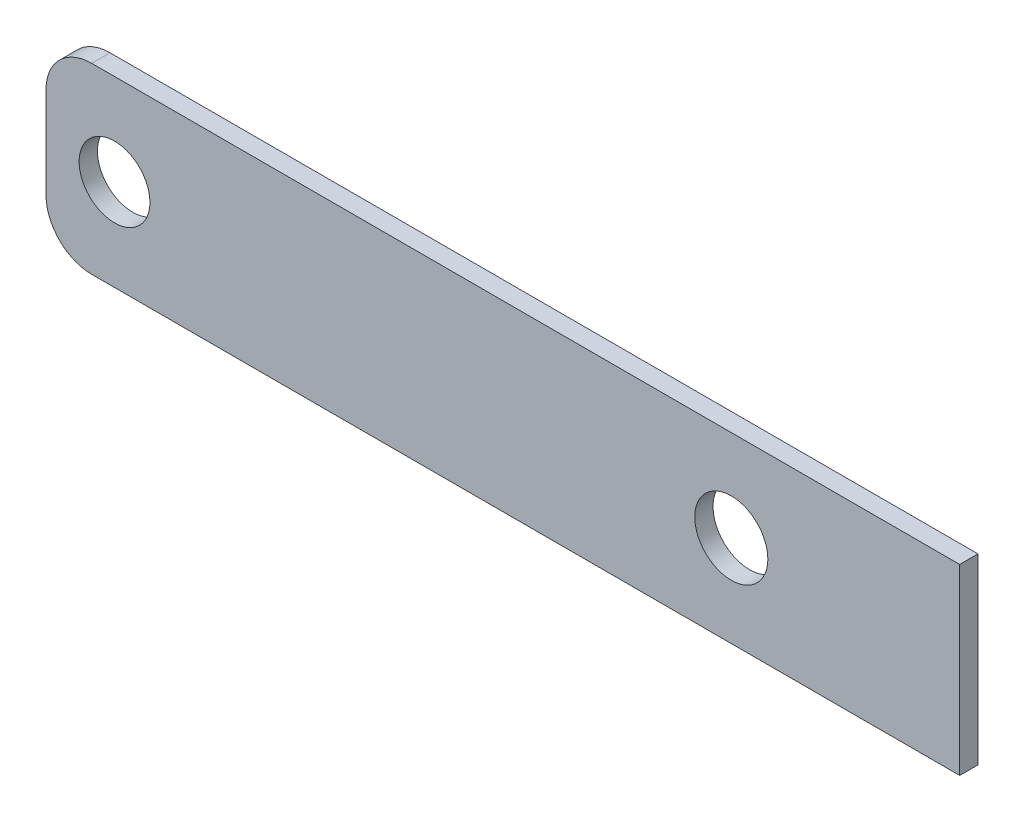
ISO-10303-21;
HEADER;
FILE_DESCRIPTION(('STEP AP214'),'2;1');
FILE_NAME('part.step','',(''),(''),'','','');
FILE_SCHEMA(('AUTOMOTIVE_DESIGN { 1 0 10303 214 1 1 1 1 }'));
ENDSEC;
DATA;
#1=APPLICATION_CONTEXT('core data for automotive mechanical design processes');
#2=APPLICATION_PROTOCOL_DEFINITION('international standard','automotive_design',2000,#1);
#3=PRODUCT_CONTEXT('',#1,'mechanical');
#4=PRODUCT('Part','Part','',(#3));
#5=PRODUCT_RELATED_PRODUCT_CATEGORY('part','',(#4));
#6=PRODUCT_DEFINITION_FORMATION('','',#4);
#7=PRODUCT_DEFINITION_CONTEXT('part definition',#1,'design');
#8=PRODUCT_DEFINITION('design','',#6,#7);
#9=PRODUCT_DEFINITION_SHAPE('','',#8);
#10=(LENGTH_UNIT() NAMED_UNIT(*) SI_UNIT(.MILLI.,.METRE.));
#11=(NAMED_UNIT(*) PLANE_ANGLE_UNIT() SI_UNIT($,.RADIAN.));
#12=(NAMED_UNIT(*) SI_UNIT($,.STERADIAN.) SOLID_ANGLE_UNIT());
#13=UNCERTAINTY_MEASURE_WITH_UNIT(LENGTH_MEASURE(1.E-05),#10,'distance_accuracy_value','');
#14=(GEOMETRIC_REPRESENTATION_CONTEXT(3) GLOBAL_UNCERTAINTY_ASSIGNED_CONTEXT((#13)) GLOBAL_UNIT_ASSIGNED_CONTEXT((#10,
#11,#12)) REPRESENTATION_CONTEXT('',''));
#15=CARTESIAN_POINT('',(0.,0.,0.));
#16=DIRECTION('',(0.,0.,1.));
#17=DIRECTION('',(1.,0.,0.));
#18=AXIS2_PLACEMENT_3D('',#15,#16,#17);
#19=CARTESIAN_POINT('',(100.,20.,-4.));
#20=DIRECTION('',(1.,0.,0.));
#21=DIRECTION('',(0.,0.,-1.));
#22=AXIS2_PLACEMENT_3D('',#19,#20,#21);
#23=PLANE('',#22);
#24=DIRECTION('',(0.,1.,0.));
#25=VECTOR('',#24,1.);
#26=CARTESIAN_POINT('',(100.,20.,0.));
#27=LINE('',#26,#25);
#28=CARTESIAN_POINT('',(100.,-20.,0.));
#29=VERTEX_POINT('',#28);
#30=CARTESIAN_POINT('',(100.,20.,0.));
#31=VERTEX_POINT('',#30);
#32=EDGE_CURVE('E129',#29,#31,#27,.T.);
#33=ORIENTED_EDGE('',*,*,#32,.F.);
#34=DIRECTION('',(0.,0.,1.));
#35=VECTOR('',#34,1.);
#36=CARTESIAN_POINT('',(100.,-20.,-4.));
#37=LINE('',#36,#35);
#38=CARTESIAN_POINT('',(100.,-20.,-4.));
#39=VERTEX_POINT('',#38);
#40=EDGE_CURVE('E108',#39,#29,#37,.T.);
#41=ORIENTED_EDGE('',*,*,#40,.F.);
#42=DIRECTION('',(0.,1.,0.));
#43=VECTOR('',#42,1.);
#44=CARTESIAN_POINT('',(100.,20.,-4.));
#45=LINE('',#44,#43);
#46=CARTESIAN_POINT('',(100.,20.,-4.));
#47=VERTEX_POINT('',#46);
#48=EDGE_CURVE('E113',#39,#47,#45,.T.);
#49=ORIENTED_EDGE('',*,*,#48,.T.);
#50=DIRECTION('',(0.,0.,1.));
#51=VECTOR('',#50,1.);
#52=CARTESIAN_POINT('',(100.,20.,-4.));
#53=LINE('',#52,#51);
#54=EDGE_CURVE('E98',#47,#31,#53,.T.);
#55=ORIENTED_EDGE('',*,*,#54,.T.);
#56=EDGE_LOOP('',(#33,#41,#49,#55));
#57=FACE_BOUND('',#56,.T.);
#58=ADVANCED_FACE('F43',(#57),#23,.T.);
#59=CARTESIAN_POINT('',(-100.,-20.,-4.));
#60=DIRECTION('',(0.,-1.,0.));
#61=DIRECTION('',(0.,0.,-1.));
#62=AXIS2_PLACEMENT_3D('',#59,#60,#61);
#63=PLANE('',#62);
#64=DIRECTION('',(1.,0.,0.));
#65=VECTOR('',#64,1.);
#66=CARTESIAN_POINT('',(-100.,-20.,0.));
#67=LINE('',#66,#65);
#68=CARTESIAN_POINT('',(-90.,-20.,0.));
#69=VERTEX_POINT('',#68);
#70=EDGE_CURVE('E118',#69,#29,#67,.T.);
#71=ORIENTED_EDGE('',*,*,#70,.F.);
#72=DIRECTION('',(0.,0.,1.));
#73=VECTOR('',#72,1.);
#74=CARTESIAN_POINT('',(-90.,-20.,-4.));
#75=LINE('',#74,#73);
#76=CARTESIAN_POINT('',(-90.,-20.,-4.));
#77=VERTEX_POINT('',#76);
#78=EDGE_CURVE('E66',#69,#77,#75,.F.);
#79=ORIENTED_EDGE('',*,*,#78,.T.);
#80=DIRECTION('',(1.,0.,0.));
#81=VECTOR('',#80,1.);
#82=CARTESIAN_POINT('',(-100.,-20.,-4.));
#83=LINE('',#82,#81);
#84=EDGE_CURVE('E109',#77,#39,#83,.T.);
#85=ORIENTED_EDGE('',*,*,#84,.T.);
#86=ORIENTED_EDGE('',*,*,#40,.T.);
#87=EDGE_LOOP('',(#71,#79,#85,#86));
#88=FACE_BOUND('',#87,.T.);
#89=ADVANCED_FACE('F155',(#88),#63,.T.);
#90=CARTESIAN_POINT('',(-100.,20.,-4.));
#91=DIRECTION('',(-1.,0.,0.));
#92=DIRECTION('',(0.,0.,1.));
#93=AXIS2_PLACEMENT_3D('',#90,#91,#92);
#94=PLANE('',#93);
#95=DIRECTION('',(0.,-1.,0.));
#96=VECTOR('',#95,1.);
#97=CARTESIAN_POINT('',(-100.,20.,-4.));
#98=LINE('',#97,#96);
#99=CARTESIAN_POINT('',(-100.,10.,-4.));
#100=VERTEX_POINT('',#99);
#101=CARTESIAN_POINT('',(-100.,-10.,-4.));
#102=VERTEX_POINT('',#101);
#103=EDGE_CURVE('E114',#100,#102,#98,.T.);
#104=ORIENTED_EDGE('',*,*,#103,.T.);
#105=DIRECTION('',(0.,0.,1.));
#106=VECTOR('',#105,1.);
#107=CARTESIAN_POINT('',(-100.,-10.,-4.));
#108=LINE('',#107,#106);
#109=CARTESIAN_POINT('',(-100.,-10.,0.));
#110=VERTEX_POINT('',#109);
#111=EDGE_CURVE('E137',#102,#110,#108,.T.);
#112=ORIENTED_EDGE('',*,*,#111,.T.);
#113=DIRECTION('',(0.,-1.,0.));
#114=VECTOR('',#113,1.);
#115=CARTESIAN_POINT('',(-100.,20.,0.));
#116=LINE('',#115,#114);
#117=CARTESIAN_POINT('',(-100.,10.,0.));
#118=VERTEX_POINT('',#117);
#119=EDGE_CURVE('E120',#118,#110,#116,.T.);
#120=ORIENTED_EDGE('',*,*,#119,.F.);
#121=DIRECTION('',(0.,0.,1.));
#122=VECTOR('',#121,1.);
#123=CARTESIAN_POINT('',(-100.,10.,-4.));
#124=LINE('',#123,#122);
#125=EDGE_CURVE('E134',#118,#100,#124,.F.);
#126=ORIENTED_EDGE('',*,*,#125,.T.);
#127=EDGE_LOOP('',(#104,#112,#120,#126));
#128=FACE_BOUND('',#127,.T.);
#129=ADVANCED_FACE('F149',(#128),#94,.T.);
#130=CARTESIAN_POINT('',(-100.,20.,-4.));
#131=DIRECTION('',(0.,1.,0.));
#132=DIRECTION('',(0.,0.,1.));
#133=AXIS2_PLACEMENT_3D('',#130,#131,#132);
#134=PLANE('',#133);
#135=DIRECTION('',(-1.,0.,0.));
#136=VECTOR('',#135,1.);
#137=CARTESIAN_POINT('',(-100.,20.,-4.));
#138=LINE('',#137,#136);
#139=CARTESIAN_POINT('',(-90.,20.,-4.));
#140=VERTEX_POINT('',#139);
#141=EDGE_CURVE('E100',#47,#140,#138,.T.);
#142=ORIENTED_EDGE('',*,*,#141,.T.);
#143=DIRECTION('',(0.,0.,1.));
#144=VECTOR('',#143,1.);
#145=CARTESIAN_POINT('',(-90.,20.,-4.));
#146=LINE('',#145,#144);
#147=CARTESIAN_POINT('',(-90.,20.,0.));
#148=VERTEX_POINT('',#147);
#149=EDGE_CURVE('E11',#140,#148,#146,.T.);
#150=ORIENTED_EDGE('',*,*,#149,.T.);
#151=DIRECTION('',(-1.,0.,0.));
#152=VECTOR('',#151,1.);
#153=CARTESIAN_POINT('',(-100.,20.,0.));
#154=LINE('',#153,#152);
#155=EDGE_CURVE('E103',#31,#148,#154,.T.);
#156=ORIENTED_EDGE('',*,*,#155,.F.);
#157=ORIENTED_EDGE('',*,*,#54,.F.);
#158=EDGE_LOOP('',(#142,#150,#156,#157));
#159=FACE_BOUND('',#158,.T.);
#160=ADVANCED_FACE('F99',(#159),#134,.T.);
#161=CARTESIAN_POINT('',(0.,0.,-4.));
#162=DIRECTION('',(0.,0.,1.));
#163=DIRECTION('',(1.,0.,0.));
#164=AXIS2_PLACEMENT_3D('',#161,#162,#163);
#165=PLANE('',#164);
#166=CARTESIAN_POINT('',(-85.,0.,-4.));
#167=DIRECTION('',(0.,0.,1.));
#168=DIRECTION('',(1.,0.,0.));
#169=AXIS2_PLACEMENT_3D('',#166,#167,#168);
#170=CIRCLE('',#169,7.75);
#171=CARTESIAN_POINT('',(-77.25,0.,-4.));
#172=VERTEX_POINT('',#171);
#173=EDGE_CURVE('E123',#172,#172,#170,.T.);
#174=ORIENTED_EDGE('',*,*,#173,.T.);
#175=EDGE_LOOP('',(#174));
#176=FACE_BOUND('',#175,.T.);
#177=CARTESIAN_POINT('',(50.,0.,-4.));
#178=DIRECTION('',(0.,0.,1.));
#179=DIRECTION('',(1.,0.,0.));
#180=AXIS2_PLACEMENT_3D('',#177,#178,#179);
#181=CIRCLE('',#180,8.);
#182=CARTESIAN_POINT('',(58.,0.,-4.));
#183=VERTEX_POINT('',#182);
#184=EDGE_CURVE('E193',#183,#183,#181,.T.);
#185=ORIENTED_EDGE('',*,*,#184,.T.);
#186=EDGE_LOOP('',(#185));
#187=FACE_BOUND('',#186,.T.);
#188=ORIENTED_EDGE('',*,*,#84,.F.);
#189=CARTESIAN_POINT('',(-90.,-10.,-4.));
#190=DIRECTION('',(0.,0.,1.));
#191=DIRECTION('',(1.,0.,0.));
#192=AXIS2_PLACEMENT_3D('',#189,#190,#191);
#193=CIRCLE('',#192,10.);
#194=EDGE_CURVE('E51',#77,#102,#193,.F.);
#195=ORIENTED_EDGE('',*,*,#194,.T.);
#196=ORIENTED_EDGE('',*,*,#103,.F.);
#197=CARTESIAN_POINT('',(-90.,10.,-4.));
#198=DIRECTION('',(0.,0.,1.));
#199=DIRECTION('',(1.,0.,0.));
#200=AXIS2_PLACEMENT_3D('',#197,#198,#199);
#201=CIRCLE('',#200,10.);
#202=EDGE_CURVE('E58',#100,#140,#201,.F.);
#203=ORIENTED_EDGE('',*,*,#202,.T.);
#204=ORIENTED_EDGE('',*,*,#141,.F.);
#205=ORIENTED_EDGE('',*,*,#48,.F.);
#206=EDGE_LOOP('',(#188,#195,#196,#203,#204,#205));
#207=FACE_BOUND('',#206,.T.);
#208=ADVANCED_FACE('F112',(#176,#187,#207),#165,.F.);
#209=CARTESIAN_POINT('',(0.,0.,0.));
#210=DIRECTION('',(0.,0.,1.));
#211=DIRECTION('',(1.,0.,0.));
#212=AXIS2_PLACEMENT_3D('',#209,#210,#211);
#213=PLANE('',#212);
#214=CARTESIAN_POINT('',(-85.,0.,0.));
#215=DIRECTION('',(0.,0.,1.));
#216=DIRECTION('',(1.,0.,0.));
#217=AXIS2_PLACEMENT_3D('',#214,#215,#216);
#218=CIRCLE('',#217,7.75);
#219=CARTESIAN_POINT('',(-77.25,0.,0.));
#220=VERTEX_POINT('',#219);
#221=EDGE_CURVE('E190',#220,#220,#218,.T.);
#222=ORIENTED_EDGE('',*,*,#221,.F.);
#223=EDGE_LOOP('',(#222));
#224=FACE_BOUND('',#223,.T.);
#225=CARTESIAN_POINT('',(50.,0.,0.));
#226=DIRECTION('',(0.,0.,1.));
#227=DIRECTION('',(1.,0.,0.));
#228=AXIS2_PLACEMENT_3D('',#225,#226,#227);
#229=CIRCLE('',#228,8.);
#230=CARTESIAN_POINT('',(58.,0.,0.));
#231=VERTEX_POINT('',#230);
#232=EDGE_CURVE('E197',#231,#231,#229,.T.);
#233=ORIENTED_EDGE('',*,*,#232,.F.);
#234=EDGE_LOOP('',(#233));
#235=FACE_BOUND('',#234,.T.);
#236=ORIENTED_EDGE('',*,*,#119,.T.);
#237=CARTESIAN_POINT('',(-90.,-10.,0.));
#238=DIRECTION('',(0.,0.,1.));
#239=DIRECTION('',(1.,0.,0.));
#240=AXIS2_PLACEMENT_3D('',#237,#238,#239);
#241=CIRCLE('',#240,10.);
#242=EDGE_CURVE('E142',#110,#69,#241,.T.);
#243=ORIENTED_EDGE('',*,*,#242,.T.);
#244=ORIENTED_EDGE('',*,*,#70,.T.);
#245=ORIENTED_EDGE('',*,*,#32,.T.);
#246=ORIENTED_EDGE('',*,*,#155,.T.);
#247=CARTESIAN_POINT('',(-90.,10.,0.));
#248=DIRECTION('',(0.,0.,1.));
#249=DIRECTION('',(1.,0.,0.));
#250=AXIS2_PLACEMENT_3D('',#247,#248,#249);
#251=CIRCLE('',#250,10.);
#252=EDGE_CURVE('E140',#148,#118,#251,.T.);
#253=ORIENTED_EDGE('',*,*,#252,.T.);
#254=EDGE_LOOP('',(#236,#243,#244,#245,#246,#253));
#255=FACE_BOUND('',#254,.T.);
#256=ADVANCED_FACE('F154',(#224,#235,#255),#213,.T.);
#257=CARTESIAN_POINT('',(50.,0.,-10.));
#258=DIRECTION('',(0.,0.,1.));
#259=DIRECTION('',(1.,0.,0.));
#260=AXIS2_PLACEMENT_3D('',#257,#258,#259);
#261=CYLINDRICAL_SURFACE('',#260,8.);
#262=ORIENTED_EDGE('',*,*,#232,.T.);
#263=EDGE_LOOP('',(#262));
#264=FACE_BOUND('',#263,.T.);
#265=ORIENTED_EDGE('',*,*,#184,.F.);
#266=EDGE_LOOP('',(#265));
#267=FACE_BOUND('',#266,.T.);
#268=ADVANCED_FACE('F175',(#264,#267),#261,.F.);
#269=CARTESIAN_POINT('',(-85.,0.,-10.));
#270=DIRECTION('',(0.,0.,1.));
#271=DIRECTION('',(1.,0.,0.));
#272=AXIS2_PLACEMENT_3D('',#269,#270,#271);
#273=CYLINDRICAL_SURFACE('',#272,7.75);
#274=ORIENTED_EDGE('',*,*,#221,.T.);
#275=EDGE_LOOP('',(#274));
#276=FACE_BOUND('',#275,.T.);
#277=ORIENTED_EDGE('',*,*,#173,.F.);
#278=EDGE_LOOP('',(#277));
#279=FACE_BOUND('',#278,.T.);
#280=ADVANCED_FACE('F161',(#276,#279),#273,.F.);
#281=CARTESIAN_POINT('',(-90.,-10.,-4.));
#282=DIRECTION('',(0.,0.,1.));
#283=DIRECTION('',(1.,0.,0.));
#284=AXIS2_PLACEMENT_3D('',#281,#282,#283);
#285=CYLINDRICAL_SURFACE('',#284,10.);
#286=ORIENTED_EDGE('',*,*,#194,.F.);
#287=ORIENTED_EDGE('',*,*,#78,.F.);
#288=ORIENTED_EDGE('',*,*,#242,.F.);
#289=ORIENTED_EDGE('',*,*,#111,.F.);
#290=EDGE_LOOP('',(#286,#287,#288,#289));
#291=FACE_BOUND('',#290,.T.);
#292=ADVANCED_FACE('F152',(#291),#285,.T.);
#293=CARTESIAN_POINT('',(-90.,10.,-4.));
#294=DIRECTION('',(0.,0.,1.));
#295=DIRECTION('',(1.,0.,0.));
#296=AXIS2_PLACEMENT_3D('',#293,#294,#295);
#297=CYLINDRICAL_SURFACE('',#296,10.);
#298=ORIENTED_EDGE('',*,*,#202,.F.);
#299=ORIENTED_EDGE('',*,*,#125,.F.);
#300=ORIENTED_EDGE('',*,*,#252,.F.);
#301=ORIENTED_EDGE('',*,*,#149,.F.);
#302=EDGE_LOOP('',(#298,#299,#300,#301));
#303=FACE_BOUND('',#302,.T.);
#304=ADVANCED_FACE('F45',(#303),#297,.T.);
#305=CLOSED_SHELL('',(#58,#89,#129,#160,#208,#256,#268,#280,#292,#304));
#306=MANIFOLD_SOLID_BREP('B2',#305);
#307=ADVANCED_BREP_SHAPE_REPRESENTATION('',(#18,#306),#14);
#308=SHAPE_DEFINITION_REPRESENTATION(#9,#307);
ENDSEC;
END-ISO-10303-21;
